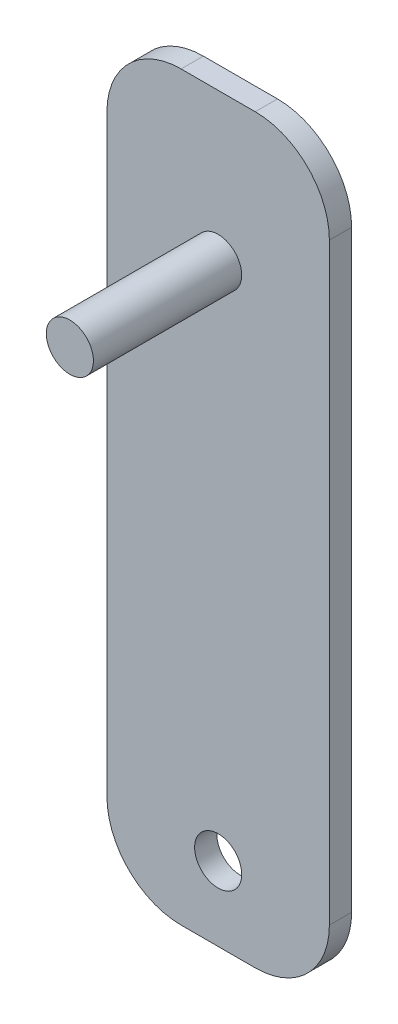
ISO-10303-21;
HEADER;
FILE_DESCRIPTION(('STEP AP214'),'2;1');
FILE_NAME('part.step','',(''),(''),'','','');
FILE_SCHEMA(('AUTOMOTIVE_DESIGN { 1 0 10303 214 1 1 1 1 }'));
ENDSEC;
DATA;
#1=APPLICATION_CONTEXT('core data for automotive mechanical design processes');
#2=APPLICATION_PROTOCOL_DEFINITION('international standard','automotive_design',2000,#1);
#3=PRODUCT_CONTEXT('',#1,'mechanical');
#4=PRODUCT('Part','Part','',(#3));
#5=PRODUCT_RELATED_PRODUCT_CATEGORY('part','',(#4));
#6=PRODUCT_DEFINITION_FORMATION('','',#4);
#7=PRODUCT_DEFINITION_CONTEXT('part definition',#1,'design');
#8=PRODUCT_DEFINITION('design','',#6,#7);
#9=PRODUCT_DEFINITION_SHAPE('','',#8);
#10=(LENGTH_UNIT() NAMED_UNIT(*) SI_UNIT(.MILLI.,.METRE.));
#11=(NAMED_UNIT(*) PLANE_ANGLE_UNIT() SI_UNIT($,.RADIAN.));
#12=(NAMED_UNIT(*) SI_UNIT($,.STERADIAN.) SOLID_ANGLE_UNIT());
#13=UNCERTAINTY_MEASURE_WITH_UNIT(LENGTH_MEASURE(1.E-05),#10,'distance_accuracy_value','');
#14=(GEOMETRIC_REPRESENTATION_CONTEXT(3) GLOBAL_UNCERTAINTY_ASSIGNED_CONTEXT((#13)) GLOBAL_UNIT_ASSIGNED_CONTEXT((#10,
#11,#12)) REPRESENTATION_CONTEXT('',''));
#15=CARTESIAN_POINT('',(0.,0.,0.));
#16=DIRECTION('',(0.,0.,1.));
#17=DIRECTION('',(1.,0.,0.));
#18=AXIS2_PLACEMENT_3D('',#15,#16,#17);
#19=CARTESIAN_POINT('',(5.00000000000001,40.,3.));
#20=DIRECTION('',(0.,0.,1.));
#21=DIRECTION('',(1.,0.,0.));
#22=AXIS2_PLACEMENT_3D('',#19,#20,#21);
#23=PLANE('',#22);
#24=CARTESIAN_POINT('',(0.,30.,3.));
#25=DIRECTION('',(0.,0.,1.));
#26=DIRECTION('',(1.,0.,0.));
#27=AXIS2_PLACEMENT_3D('',#24,#25,#26);
#28=CIRCLE('',#27,3.175);
#29=CARTESIAN_POINT('',(3.175,30.,3.));
#30=VERTEX_POINT('',#29);
#31=EDGE_CURVE('E185',#30,#30,#28,.T.);
#32=ORIENTED_EDGE('',*,*,#31,.F.);
#33=EDGE_LOOP('',(#32));
#34=FACE_BOUND('',#33,.T.);
#35=CARTESIAN_POINT('',(5.00000000000001,40.,3.));
#36=DIRECTION('',(0.,0.,1.));
#37=DIRECTION('',(1.,0.,0.));
#38=AXIS2_PLACEMENT_3D('',#35,#36,#37);
#39=CIRCLE('',#38,10.);
#40=CARTESIAN_POINT('',(15.,39.9999999999999,3.));
#41=VERTEX_POINT('',#40);
#42=CARTESIAN_POINT('',(4.99999999999994,50.,3.));
#43=VERTEX_POINT('',#42);
#44=EDGE_CURVE('E145',#41,#43,#39,.T.);
#45=ORIENTED_EDGE('',*,*,#44,.T.);
#46=DIRECTION('',(-1.,0.,0.));
#47=VECTOR('',#46,1.);
#48=CARTESIAN_POINT('',(4.99999999999994,50.,3.));
#49=LINE('',#48,#47);
#50=CARTESIAN_POINT('',(-4.99999999999992,50.,3.));
#51=VERTEX_POINT('',#50);
#52=EDGE_CURVE('E93',#43,#51,#49,.T.);
#53=ORIENTED_EDGE('',*,*,#52,.T.);
#54=CARTESIAN_POINT('',(-4.99999999999999,40.,3.));
#55=DIRECTION('',(0.,0.,1.));
#56=DIRECTION('',(1.,0.,0.));
#57=AXIS2_PLACEMENT_3D('',#54,#55,#56);
#58=CIRCLE('',#57,10.);
#59=CARTESIAN_POINT('',(-15.,39.9999999999999,3.));
#60=VERTEX_POINT('',#59);
#61=EDGE_CURVE('E160',#51,#60,#58,.T.);
#62=ORIENTED_EDGE('',*,*,#61,.T.);
#63=DIRECTION('',(0.,-1.,0.));
#64=VECTOR('',#63,1.);
#65=CARTESIAN_POINT('',(-15.,-39.9999999999999,3.));
#66=LINE('',#65,#64);
#67=CARTESIAN_POINT('',(-15.,-40.,3.));
#68=VERTEX_POINT('',#67);
#69=EDGE_CURVE('E173',#60,#68,#66,.T.);
#70=ORIENTED_EDGE('',*,*,#69,.T.);
#71=CARTESIAN_POINT('',(-5.,-40.,3.));
#72=DIRECTION('',(0.,0.,1.));
#73=DIRECTION('',(-1.,0.,0.));
#74=AXIS2_PLACEMENT_3D('',#71,#72,#73);
#75=CIRCLE('',#74,9.99999999999999);
#76=CARTESIAN_POINT('',(-4.99999999999992,-50.,3.));
#77=VERTEX_POINT('',#76);
#78=EDGE_CURVE('E112',#68,#77,#75,.T.);
#79=ORIENTED_EDGE('',*,*,#78,.T.);
#80=DIRECTION('',(1.,0.,0.));
#81=VECTOR('',#80,1.);
#82=CARTESIAN_POINT('',(4.99999999999994,-50.,3.));
#83=LINE('',#82,#81);
#84=CARTESIAN_POINT('',(4.99999999999993,-50.,3.));
#85=VERTEX_POINT('',#84);
#86=EDGE_CURVE('E106',#77,#85,#83,.T.);
#87=ORIENTED_EDGE('',*,*,#86,.T.);
#88=CARTESIAN_POINT('',(5.,-40.,3.));
#89=DIRECTION('',(0.,0.,1.));
#90=DIRECTION('',(1.,0.,0.));
#91=AXIS2_PLACEMENT_3D('',#88,#89,#90);
#92=CIRCLE('',#91,10.);
#93=CARTESIAN_POINT('',(15.,-39.9999999999999,3.));
#94=VERTEX_POINT('',#93);
#95=EDGE_CURVE('E110',#85,#94,#92,.T.);
#96=ORIENTED_EDGE('',*,*,#95,.T.);
#97=DIRECTION('',(0.,1.,0.));
#98=VECTOR('',#97,1.);
#99=CARTESIAN_POINT('',(15.,-39.9999999999999,3.));
#100=LINE('',#99,#98);
#101=EDGE_CURVE('E50',#94,#41,#100,.T.);
#102=ORIENTED_EDGE('',*,*,#101,.T.);
#103=EDGE_LOOP('',(#45,#53,#62,#70,#79,#87,#96,#102));
#104=FACE_BOUND('',#103,.T.);
#105=CARTESIAN_POINT('',(0.,-40.,3.));
#106=DIRECTION('',(0.,0.,1.));
#107=DIRECTION('',(1.,0.,0.));
#108=AXIS2_PLACEMENT_3D('',#105,#106,#107);
#109=CIRCLE('',#108,3.175);
#110=CARTESIAN_POINT('',(3.175,-40.,3.));
#111=VERTEX_POINT('',#110);
#112=EDGE_CURVE('E134',#111,#111,#109,.T.);
#113=ORIENTED_EDGE('',*,*,#112,.F.);
#114=EDGE_LOOP('',(#113));
#115=FACE_BOUND('',#114,.T.);
#116=ADVANCED_FACE('F33',(#34,#104,#115),#23,.T.);
#117=CARTESIAN_POINT('',(5.00000000000001,40.,0.));
#118=DIRECTION('',(0.,0.,1.));
#119=DIRECTION('',(1.,0.,0.));
#120=AXIS2_PLACEMENT_3D('',#117,#118,#119);
#121=PLANE('',#120);
#122=CARTESIAN_POINT('',(5.00000000000001,40.,0.));
#123=DIRECTION('',(0.,0.,1.));
#124=DIRECTION('',(1.,0.,0.));
#125=AXIS2_PLACEMENT_3D('',#122,#123,#124);
#126=CIRCLE('',#125,10.);
#127=CARTESIAN_POINT('',(15.,39.9999999999999,0.));
#128=VERTEX_POINT('',#127);
#129=CARTESIAN_POINT('',(4.99999999999994,50.,0.));
#130=VERTEX_POINT('',#129);
#131=EDGE_CURVE('E130',#128,#130,#126,.T.);
#132=ORIENTED_EDGE('',*,*,#131,.F.);
#133=DIRECTION('',(0.,1.,0.));
#134=VECTOR('',#133,1.);
#135=CARTESIAN_POINT('',(15.,-39.9999999999999,0.));
#136=LINE('',#135,#134);
#137=CARTESIAN_POINT('',(15.,-39.9999999999999,0.));
#138=VERTEX_POINT('',#137);
#139=EDGE_CURVE('E85',#138,#128,#136,.T.);
#140=ORIENTED_EDGE('',*,*,#139,.F.);
#141=CARTESIAN_POINT('',(5.,-40.,0.));
#142=DIRECTION('',(0.,0.,1.));
#143=DIRECTION('',(1.,0.,0.));
#144=AXIS2_PLACEMENT_3D('',#141,#142,#143);
#145=CIRCLE('',#144,10.);
#146=CARTESIAN_POINT('',(4.99999999999993,-50.,0.));
#147=VERTEX_POINT('',#146);
#148=EDGE_CURVE('E79',#147,#138,#145,.T.);
#149=ORIENTED_EDGE('',*,*,#148,.F.);
#150=DIRECTION('',(1.,0.,0.));
#151=VECTOR('',#150,1.);
#152=CARTESIAN_POINT('',(4.99999999999994,-50.,0.));
#153=LINE('',#152,#151);
#154=CARTESIAN_POINT('',(-4.99999999999992,-50.,0.));
#155=VERTEX_POINT('',#154);
#156=EDGE_CURVE('E120',#155,#147,#153,.T.);
#157=ORIENTED_EDGE('',*,*,#156,.F.);
#158=CARTESIAN_POINT('',(-5.,-40.,0.));
#159=DIRECTION('',(0.,0.,1.));
#160=DIRECTION('',(-1.,0.,0.));
#161=AXIS2_PLACEMENT_3D('',#158,#159,#160);
#162=CIRCLE('',#161,9.99999999999999);
#163=CARTESIAN_POINT('',(-15.,-40.,0.));
#164=VERTEX_POINT('',#163);
#165=EDGE_CURVE('E140',#164,#155,#162,.T.);
#166=ORIENTED_EDGE('',*,*,#165,.F.);
#167=DIRECTION('',(0.,-1.,0.));
#168=VECTOR('',#167,1.);
#169=CARTESIAN_POINT('',(-15.,-39.9999999999999,0.));
#170=LINE('',#169,#168);
#171=CARTESIAN_POINT('',(-15.,39.9999999999999,0.));
#172=VERTEX_POINT('',#171);
#173=EDGE_CURVE('E138',#172,#164,#170,.T.);
#174=ORIENTED_EDGE('',*,*,#173,.F.);
#175=CARTESIAN_POINT('',(-4.99999999999999,40.,0.));
#176=DIRECTION('',(0.,0.,1.));
#177=DIRECTION('',(1.,0.,0.));
#178=AXIS2_PLACEMENT_3D('',#175,#176,#177);
#179=CIRCLE('',#178,10.);
#180=CARTESIAN_POINT('',(-4.99999999999992,50.,0.));
#181=VERTEX_POINT('',#180);
#182=EDGE_CURVE('E136',#181,#172,#179,.T.);
#183=ORIENTED_EDGE('',*,*,#182,.F.);
#184=DIRECTION('',(-1.,0.,0.));
#185=VECTOR('',#184,1.);
#186=CARTESIAN_POINT('',(4.99999999999994,50.,0.));
#187=LINE('',#186,#185);
#188=EDGE_CURVE('E133',#130,#181,#187,.T.);
#189=ORIENTED_EDGE('',*,*,#188,.F.);
#190=EDGE_LOOP('',(#132,#140,#149,#157,#166,#174,#183,#189));
#191=FACE_BOUND('',#190,.T.);
#192=CARTESIAN_POINT('',(0.,-40.,0.));
#193=DIRECTION('',(0.,0.,1.));
#194=DIRECTION('',(1.,0.,0.));
#195=AXIS2_PLACEMENT_3D('',#192,#193,#194);
#196=CIRCLE('',#195,3.175);
#197=CARTESIAN_POINT('',(3.175,-40.,0.));
#198=VERTEX_POINT('',#197);
#199=EDGE_CURVE('E179',#198,#198,#196,.T.);
#200=ORIENTED_EDGE('',*,*,#199,.T.);
#201=EDGE_LOOP('',(#200));
#202=FACE_BOUND('',#201,.T.);
#203=ADVANCED_FACE('F164',(#191,#202),#121,.F.);
#204=CARTESIAN_POINT('',(5.00000000000001,40.,3.));
#205=DIRECTION('',(0.,0.,-1.));
#206=DIRECTION('',(-1.,0.,0.));
#207=AXIS2_PLACEMENT_3D('',#204,#205,#206);
#208=CYLINDRICAL_SURFACE('',#207,10.);
#209=ORIENTED_EDGE('',*,*,#131,.T.);
#210=DIRECTION('',(0.,0.,-1.));
#211=VECTOR('',#210,1.);
#212=CARTESIAN_POINT('',(4.99999999999994,50.,3.));
#213=LINE('',#212,#211);
#214=EDGE_CURVE('E11',#43,#130,#213,.T.);
#215=ORIENTED_EDGE('',*,*,#214,.F.);
#216=ORIENTED_EDGE('',*,*,#44,.F.);
#217=DIRECTION('',(0.,0.,-1.));
#218=VECTOR('',#217,1.);
#219=CARTESIAN_POINT('',(15.,39.9999999999999,3.));
#220=LINE('',#219,#218);
#221=EDGE_CURVE('E126',#41,#128,#220,.T.);
#222=ORIENTED_EDGE('',*,*,#221,.T.);
#223=EDGE_LOOP('',(#209,#215,#216,#222));
#224=FACE_BOUND('',#223,.T.);
#225=ADVANCED_FACE('F35',(#224),#208,.T.);
#226=CARTESIAN_POINT('',(4.99999999999994,50.,3.));
#227=DIRECTION('',(0.,-1.,0.));
#228=DIRECTION('',(0.,0.,-1.));
#229=AXIS2_PLACEMENT_3D('',#226,#227,#228);
#230=PLANE('',#229);
#231=ORIENTED_EDGE('',*,*,#188,.T.);
#232=DIRECTION('',(0.,0.,-1.));
#233=VECTOR('',#232,1.);
#234=CARTESIAN_POINT('',(-4.99999999999992,50.,3.));
#235=LINE('',#234,#233);
#236=EDGE_CURVE('E42',#51,#181,#235,.T.);
#237=ORIENTED_EDGE('',*,*,#236,.F.);
#238=ORIENTED_EDGE('',*,*,#52,.F.);
#239=ORIENTED_EDGE('',*,*,#214,.T.);
#240=EDGE_LOOP('',(#231,#237,#238,#239));
#241=FACE_BOUND('',#240,.T.);
#242=ADVANCED_FACE('F220',(#241),#230,.F.);
#243=CARTESIAN_POINT('',(-4.99999999999999,40.,3.));
#244=DIRECTION('',(0.,0.,-1.));
#245=DIRECTION('',(-1.,0.,0.));
#246=AXIS2_PLACEMENT_3D('',#243,#244,#245);
#247=CYLINDRICAL_SURFACE('',#246,10.);
#248=ORIENTED_EDGE('',*,*,#182,.T.);
#249=DIRECTION('',(0.,0.,-1.));
#250=VECTOR('',#249,1.);
#251=CARTESIAN_POINT('',(-15.,39.9999999999999,3.));
#252=LINE('',#251,#250);
#253=EDGE_CURVE('E152',#60,#172,#252,.T.);
#254=ORIENTED_EDGE('',*,*,#253,.F.);
#255=ORIENTED_EDGE('',*,*,#61,.F.);
#256=ORIENTED_EDGE('',*,*,#236,.T.);
#257=EDGE_LOOP('',(#248,#254,#255,#256));
#258=FACE_BOUND('',#257,.T.);
#259=ADVANCED_FACE('F158',(#258),#247,.T.);
#260=CARTESIAN_POINT('',(-15.,-39.9999999999999,3.));
#261=DIRECTION('',(1.,0.,0.));
#262=DIRECTION('',(0.,0.,-1.));
#263=AXIS2_PLACEMENT_3D('',#260,#261,#262);
#264=PLANE('',#263);
#265=ORIENTED_EDGE('',*,*,#173,.T.);
#266=DIRECTION('',(0.,0.,-1.));
#267=VECTOR('',#266,1.);
#268=CARTESIAN_POINT('',(-15.,-40.,3.));
#269=LINE('',#268,#267);
#270=EDGE_CURVE('E149',#68,#164,#269,.T.);
#271=ORIENTED_EDGE('',*,*,#270,.F.);
#272=ORIENTED_EDGE('',*,*,#69,.F.);
#273=ORIENTED_EDGE('',*,*,#253,.T.);
#274=EDGE_LOOP('',(#265,#271,#272,#273));
#275=FACE_BOUND('',#274,.T.);
#276=ADVANCED_FACE('F169',(#275),#264,.F.);
#277=CARTESIAN_POINT('',(-5.,-40.,3.));
#278=DIRECTION('',(0.,0.,-1.));
#279=DIRECTION('',(-1.,0.,0.));
#280=AXIS2_PLACEMENT_3D('',#277,#278,#279);
#281=CYLINDRICAL_SURFACE('',#280,9.99999999999999);
#282=ORIENTED_EDGE('',*,*,#165,.T.);
#283=DIRECTION('',(0.,0.,-1.));
#284=VECTOR('',#283,1.);
#285=CARTESIAN_POINT('',(-4.99999999999992,-50.,3.));
#286=LINE('',#285,#284);
#287=EDGE_CURVE('E121',#77,#155,#286,.T.);
#288=ORIENTED_EDGE('',*,*,#287,.F.);
#289=ORIENTED_EDGE('',*,*,#78,.F.);
#290=ORIENTED_EDGE('',*,*,#270,.T.);
#291=EDGE_LOOP('',(#282,#288,#289,#290));
#292=FACE_BOUND('',#291,.T.);
#293=ADVANCED_FACE('F172',(#292),#281,.T.);
#294=CARTESIAN_POINT('',(4.99999999999994,-50.,3.));
#295=DIRECTION('',(0.,1.,0.));
#296=DIRECTION('',(0.,0.,1.));
#297=AXIS2_PLACEMENT_3D('',#294,#295,#296);
#298=PLANE('',#297);
#299=ORIENTED_EDGE('',*,*,#156,.T.);
#300=DIRECTION('',(0.,0.,-1.));
#301=VECTOR('',#300,1.);
#302=CARTESIAN_POINT('',(4.99999999999993,-50.,3.));
#303=LINE('',#302,#301);
#304=EDGE_CURVE('E117',#85,#147,#303,.T.);
#305=ORIENTED_EDGE('',*,*,#304,.F.);
#306=ORIENTED_EDGE('',*,*,#86,.F.);
#307=ORIENTED_EDGE('',*,*,#287,.T.);
#308=EDGE_LOOP('',(#299,#305,#306,#307));
#309=FACE_BOUND('',#308,.T.);
#310=ADVANCED_FACE('F118',(#309),#298,.F.);
#311=CARTESIAN_POINT('',(5.,-40.,3.));
#312=DIRECTION('',(0.,0.,-1.));
#313=DIRECTION('',(-1.,0.,0.));
#314=AXIS2_PLACEMENT_3D('',#311,#312,#313);
#315=CYLINDRICAL_SURFACE('',#314,10.);
#316=ORIENTED_EDGE('',*,*,#148,.T.);
#317=DIRECTION('',(0.,0.,-1.));
#318=VECTOR('',#317,1.);
#319=CARTESIAN_POINT('',(15.,-39.9999999999999,3.));
#320=LINE('',#319,#318);
#321=EDGE_CURVE('E122',#94,#138,#320,.T.);
#322=ORIENTED_EDGE('',*,*,#321,.F.);
#323=ORIENTED_EDGE('',*,*,#95,.F.);
#324=ORIENTED_EDGE('',*,*,#304,.T.);
#325=EDGE_LOOP('',(#316,#322,#323,#324));
#326=FACE_BOUND('',#325,.T.);
#327=ADVANCED_FACE('F124',(#326),#315,.T.);
#328=CARTESIAN_POINT('',(15.,-39.9999999999999,3.));
#329=DIRECTION('',(-1.,0.,0.));
#330=DIRECTION('',(0.,0.,1.));
#331=AXIS2_PLACEMENT_3D('',#328,#329,#330);
#332=PLANE('',#331);
#333=ORIENTED_EDGE('',*,*,#139,.T.);
#334=ORIENTED_EDGE('',*,*,#221,.F.);
#335=ORIENTED_EDGE('',*,*,#101,.F.);
#336=ORIENTED_EDGE('',*,*,#321,.T.);
#337=EDGE_LOOP('',(#333,#334,#335,#336));
#338=FACE_BOUND('',#337,.T.);
#339=ADVANCED_FACE('F208',(#338),#332,.F.);
#340=CARTESIAN_POINT('',(0.,-40.,3.));
#341=DIRECTION('',(0.,0.,-1.));
#342=DIRECTION('',(-1.,0.,0.));
#343=AXIS2_PLACEMENT_3D('',#340,#341,#342);
#344=CYLINDRICAL_SURFACE('',#343,3.175);
#345=ORIENTED_EDGE('',*,*,#112,.T.);
#346=EDGE_LOOP('',(#345));
#347=FACE_BOUND('',#346,.T.);
#348=ORIENTED_EDGE('',*,*,#199,.F.);
#349=EDGE_LOOP('',(#348));
#350=FACE_BOUND('',#349,.T.);
#351=ADVANCED_FACE('F196',(#347,#350),#344,.F.);
#352=CARTESIAN_POINT('',(0.,30.,23.));
#353=DIRECTION('',(0.,0.,-1.));
#354=DIRECTION('',(-1.,0.,0.));
#355=AXIS2_PLACEMENT_3D('',#352,#353,#354);
#356=CYLINDRICAL_SURFACE('',#355,3.175);
#357=CARTESIAN_POINT('',(0.,30.,23.));
#358=DIRECTION('',(0.,0.,1.));
#359=DIRECTION('',(1.,0.,0.));
#360=AXIS2_PLACEMENT_3D('',#357,#358,#359);
#361=CIRCLE('',#360,3.175);
#362=CARTESIAN_POINT('',(3.175,30.,23.));
#363=VERTEX_POINT('',#362);
#364=EDGE_CURVE('E182',#363,#363,#361,.T.);
#365=ORIENTED_EDGE('',*,*,#364,.F.);
#366=EDGE_LOOP('',(#365));
#367=FACE_BOUND('',#366,.T.);
#368=ORIENTED_EDGE('',*,*,#31,.T.);
#369=EDGE_LOOP('',(#368));
#370=FACE_BOUND('',#369,.T.);
#371=ADVANCED_FACE('F193',(#367,#370),#356,.T.);
#372=CARTESIAN_POINT('',(0.,30.,23.));
#373=DIRECTION('',(0.,0.,1.));
#374=DIRECTION('',(1.,0.,0.));
#375=AXIS2_PLACEMENT_3D('',#372,#373,#374);
#376=PLANE('',#375);
#377=ORIENTED_EDGE('',*,*,#364,.T.);
#378=EDGE_LOOP('',(#377));
#379=FACE_BOUND('',#378,.T.);
#380=ADVANCED_FACE('F191',(#379),#376,.T.);
#381=CLOSED_SHELL('',(#116,#203,#225,#242,#259,#276,#293,#310,#327,#339,#351,#371,#380));
#382=MANIFOLD_SOLID_BREP('B2',#381);
#383=ADVANCED_BREP_SHAPE_REPRESENTATION('',(#18,#382),#14);
#384=SHAPE_DEFINITION_REPRESENTATION(#9,#383);
ENDSEC;
END-ISO-10303-21;
